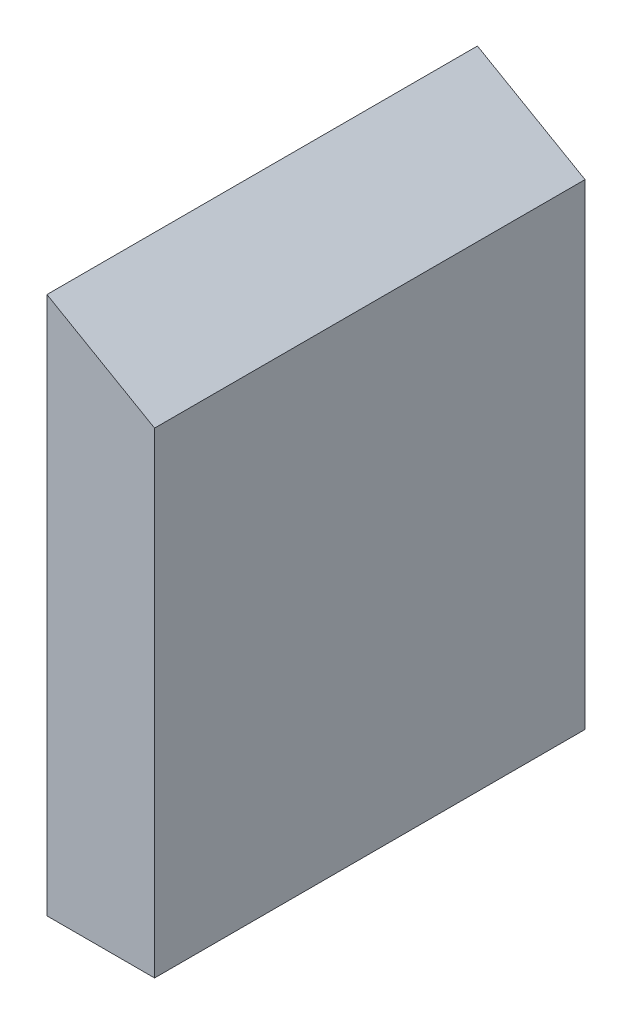
ISO-10303-21;
HEADER;
FILE_DESCRIPTION(('STEP AP214'),'2;1');
FILE_NAME('part.step','',(''),(''),'','','');
FILE_SCHEMA(('AUTOMOTIVE_DESIGN { 1 0 10303 214 1 1 1 1 }'));
ENDSEC;
DATA;
#1=APPLICATION_CONTEXT('core data for automotive mechanical design processes');
#2=APPLICATION_PROTOCOL_DEFINITION('international standard','automotive_design',2000,#1);
#3=PRODUCT_CONTEXT('',#1,'mechanical');
#4=PRODUCT('Part','Part','',(#3));
#5=PRODUCT_RELATED_PRODUCT_CATEGORY('part','',(#4));
#6=PRODUCT_DEFINITION_FORMATION('','',#4);
#7=PRODUCT_DEFINITION_CONTEXT('part definition',#1,'design');
#8=PRODUCT_DEFINITION('design','',#6,#7);
#9=PRODUCT_DEFINITION_SHAPE('','',#8);
#10=(LENGTH_UNIT() NAMED_UNIT(*) SI_UNIT(.MILLI.,.METRE.));
#11=(NAMED_UNIT(*) PLANE_ANGLE_UNIT() SI_UNIT($,.RADIAN.));
#12=(NAMED_UNIT(*) SI_UNIT($,.STERADIAN.) SOLID_ANGLE_UNIT());
#13=UNCERTAINTY_MEASURE_WITH_UNIT(LENGTH_MEASURE(1.E-05),#10,'distance_accuracy_value','');
#14=(GEOMETRIC_REPRESENTATION_CONTEXT(3) GLOBAL_UNCERTAINTY_ASSIGNED_CONTEXT((#13)) GLOBAL_UNIT_ASSIGNED_CONTEXT((#10,
#11,#12)) REPRESENTATION_CONTEXT('',''));
#15=CARTESIAN_POINT('',(0.,0.,0.));
#16=DIRECTION('',(0.,0.,1.));
#17=DIRECTION('',(1.,0.,0.));
#18=AXIS2_PLACEMENT_3D('',#15,#16,#17);
#19=CARTESIAN_POINT('',(0.,0.,40.));
#20=DIRECTION('',(0.,1.,0.));
#21=DIRECTION('',(0.,0.,1.));
#22=AXIS2_PLACEMENT_3D('',#19,#20,#21);
#23=PLANE('',#22);
#24=DIRECTION('',(1.,0.,0.));
#25=VECTOR('',#24,1.);
#26=CARTESIAN_POINT('',(0.,0.,0.));
#27=LINE('',#26,#25);
#28=CARTESIAN_POINT('',(0.,0.,0.));
#29=VERTEX_POINT('',#28);
#30=CARTESIAN_POINT('',(10.,0.,0.));
#31=VERTEX_POINT('',#30);
#32=EDGE_CURVE('E100',#29,#31,#27,.T.);
#33=ORIENTED_EDGE('',*,*,#32,.T.);
#34=DIRECTION('',(0.,0.,-1.));
#35=VECTOR('',#34,1.);
#36=CARTESIAN_POINT('',(10.,0.,40.));
#37=LINE('',#36,#35);
#38=CARTESIAN_POINT('',(10.,0.,40.));
#39=VERTEX_POINT('',#38);
#40=EDGE_CURVE('E11',#39,#31,#37,.T.);
#41=ORIENTED_EDGE('',*,*,#40,.F.);
#42=DIRECTION('',(1.,0.,0.));
#43=VECTOR('',#42,1.);
#44=CARTESIAN_POINT('',(0.,0.,40.));
#45=LINE('',#44,#43);
#46=CARTESIAN_POINT('',(0.,0.,40.));
#47=VERTEX_POINT('',#46);
#48=EDGE_CURVE('E86',#47,#39,#45,.T.);
#49=ORIENTED_EDGE('',*,*,#48,.F.);
#50=DIRECTION('',(0.,0.,-1.));
#51=VECTOR('',#50,1.);
#52=CARTESIAN_POINT('',(0.,0.,40.));
#53=LINE('',#52,#51);
#54=EDGE_CURVE('E53',#47,#29,#53,.T.);
#55=ORIENTED_EDGE('',*,*,#54,.T.);
#56=EDGE_LOOP('',(#33,#41,#49,#55));
#57=FACE_BOUND('',#56,.T.);
#58=ADVANCED_FACE('F37',(#57),#23,.F.);
#59=CARTESIAN_POINT('',(10.,0.,40.));
#60=DIRECTION('',(-1.,0.,0.));
#61=DIRECTION('',(0.,0.,1.));
#62=AXIS2_PLACEMENT_3D('',#59,#60,#61);
#63=PLANE('',#62);
#64=DIRECTION('',(0.,1.,0.));
#65=VECTOR('',#64,1.);
#66=CARTESIAN_POINT('',(10.,0.,0.));
#67=LINE('',#66,#65);
#68=CARTESIAN_POINT('',(10.,44.25,0.));
#69=VERTEX_POINT('',#68);
#70=EDGE_CURVE('E91',#31,#69,#67,.T.);
#71=ORIENTED_EDGE('',*,*,#70,.T.);
#72=DIRECTION('',(0.,0.,-1.));
#73=VECTOR('',#72,1.);
#74=CARTESIAN_POINT('',(10.,44.25,40.));
#75=LINE('',#74,#73);
#76=CARTESIAN_POINT('',(10.,44.25,40.));
#77=VERTEX_POINT('',#76);
#78=EDGE_CURVE('E45',#77,#69,#75,.T.);
#79=ORIENTED_EDGE('',*,*,#78,.F.);
#80=DIRECTION('',(0.,1.,0.));
#81=VECTOR('',#80,1.);
#82=CARTESIAN_POINT('',(10.,0.,40.));
#83=LINE('',#82,#81);
#84=EDGE_CURVE('E78',#39,#77,#83,.T.);
#85=ORIENTED_EDGE('',*,*,#84,.F.);
#86=ORIENTED_EDGE('',*,*,#40,.T.);
#87=EDGE_LOOP('',(#71,#79,#85,#86));
#88=FACE_BOUND('',#87,.T.);
#89=ADVANCED_FACE('F90',(#88),#63,.F.);
#90=CARTESIAN_POINT('',(0.,50.,40.));
#91=DIRECTION('',(0.498471124258083,0.866906303057535,0.));
#92=DIRECTION('',(-0.866906303057535,0.498471124258083,0.));
#93=AXIS2_PLACEMENT_3D('',#90,#91,#92);
#94=PLANE('',#93);
#95=DIRECTION('',(0.866906303057535,-0.498471124258083,0.));
#96=VECTOR('',#95,1.);
#97=CARTESIAN_POINT('',(0.,50.,0.));
#98=LINE('',#97,#96);
#99=CARTESIAN_POINT('',(0.,50.,0.));
#100=VERTEX_POINT('',#99);
#101=EDGE_CURVE('E103',#100,#69,#98,.T.);
#102=ORIENTED_EDGE('',*,*,#101,.F.);
#103=DIRECTION('',(0.,0.,-1.));
#104=VECTOR('',#103,1.);
#105=CARTESIAN_POINT('',(0.,50.,40.));
#106=LINE('',#105,#104);
#107=CARTESIAN_POINT('',(0.,50.,40.));
#108=VERTEX_POINT('',#107);
#109=EDGE_CURVE('E67',#108,#100,#106,.T.);
#110=ORIENTED_EDGE('',*,*,#109,.F.);
#111=DIRECTION('',(0.866906303057535,-0.498471124258083,0.));
#112=VECTOR('',#111,1.);
#113=CARTESIAN_POINT('',(0.,50.,40.));
#114=LINE('',#113,#112);
#115=EDGE_CURVE('E85',#108,#77,#114,.T.);
#116=ORIENTED_EDGE('',*,*,#115,.T.);
#117=ORIENTED_EDGE('',*,*,#78,.T.);
#118=EDGE_LOOP('',(#102,#110,#116,#117));
#119=FACE_BOUND('',#118,.T.);
#120=ADVANCED_FACE('F94',(#119),#94,.T.);
#121=CARTESIAN_POINT('',(0.,0.,40.));
#122=DIRECTION('',(-1.,0.,0.));
#123=DIRECTION('',(0.,0.,1.));
#124=AXIS2_PLACEMENT_3D('',#121,#122,#123);
#125=PLANE('',#124);
#126=DIRECTION('',(0.,1.,0.));
#127=VECTOR('',#126,1.);
#128=CARTESIAN_POINT('',(0.,0.,0.));
#129=LINE('',#128,#127);
#130=EDGE_CURVE('E105',#29,#100,#129,.T.);
#131=ORIENTED_EDGE('',*,*,#130,.F.);
#132=ORIENTED_EDGE('',*,*,#54,.F.);
#133=DIRECTION('',(0.,1.,0.));
#134=VECTOR('',#133,1.);
#135=CARTESIAN_POINT('',(0.,0.,40.));
#136=LINE('',#135,#134);
#137=EDGE_CURVE('E95',#47,#108,#136,.T.);
#138=ORIENTED_EDGE('',*,*,#137,.T.);
#139=ORIENTED_EDGE('',*,*,#109,.T.);
#140=EDGE_LOOP('',(#131,#132,#138,#139));
#141=FACE_BOUND('',#140,.T.);
#142=ADVANCED_FACE('F111',(#141),#125,.T.);
#143=CARTESIAN_POINT('',(0.,0.,40.));
#144=DIRECTION('',(0.,0.,1.));
#145=DIRECTION('',(1.,0.,0.));
#146=AXIS2_PLACEMENT_3D('',#143,#144,#145);
#147=PLANE('',#146);
#148=ORIENTED_EDGE('',*,*,#48,.T.);
#149=ORIENTED_EDGE('',*,*,#84,.T.);
#150=ORIENTED_EDGE('',*,*,#115,.F.);
#151=ORIENTED_EDGE('',*,*,#137,.F.);
#152=EDGE_LOOP('',(#148,#149,#150,#151));
#153=FACE_BOUND('',#152,.T.);
#154=ADVANCED_FACE('F82',(#153),#147,.T.);
#155=CARTESIAN_POINT('',(0.,0.,0.));
#156=DIRECTION('',(0.,0.,1.));
#157=DIRECTION('',(1.,0.,0.));
#158=AXIS2_PLACEMENT_3D('',#155,#156,#157);
#159=PLANE('',#158);
#160=ORIENTED_EDGE('',*,*,#32,.F.);
#161=ORIENTED_EDGE('',*,*,#130,.T.);
#162=ORIENTED_EDGE('',*,*,#101,.T.);
#163=ORIENTED_EDGE('',*,*,#70,.F.);
#164=EDGE_LOOP('',(#160,#161,#162,#163));
#165=FACE_BOUND('',#164,.T.);
#166=ADVANCED_FACE('F110',(#165),#159,.F.);
#167=CLOSED_SHELL('',(#58,#89,#120,#142,#154,#166));
#168=MANIFOLD_SOLID_BREP('B2',#167);
#169=ADVANCED_BREP_SHAPE_REPRESENTATION('',(#18,#168),#14);
#170=SHAPE_DEFINITION_REPRESENTATION(#9,#169);
ENDSEC;
END-ISO-10303-21;
